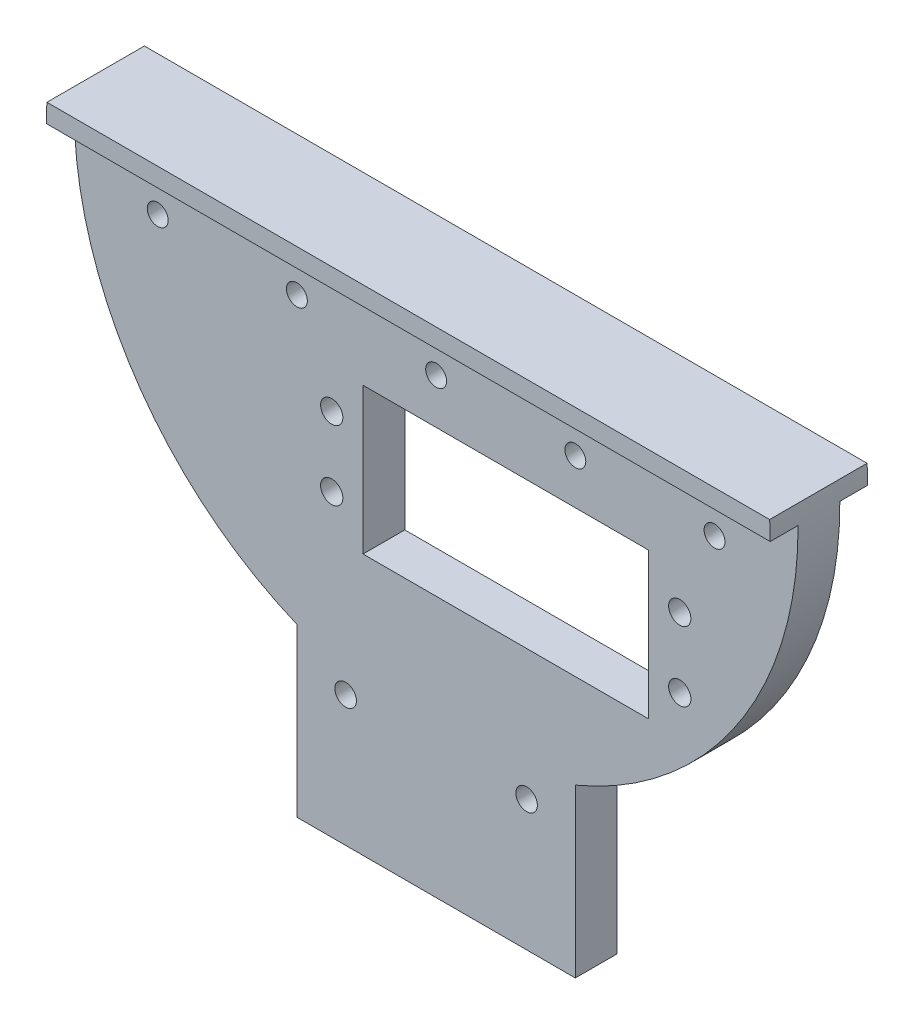
ISO-10303-21;
HEADER;
FILE_DESCRIPTION(('STEP AP214'),'2;1');
FILE_NAME('part.step','',(''),(''),'','','');
FILE_SCHEMA(('AUTOMOTIVE_DESIGN { 1 0 10303 214 1 1 1 1 }'));
ENDSEC;
DATA;
#1=APPLICATION_CONTEXT('core data for automotive mechanical design processes');
#2=APPLICATION_PROTOCOL_DEFINITION('international standard','automotive_design',2000,#1);
#3=PRODUCT_CONTEXT('',#1,'mechanical');
#4=PRODUCT('Part','Part','',(#3));
#5=PRODUCT_RELATED_PRODUCT_CATEGORY('part','',(#4));
#6=PRODUCT_DEFINITION_FORMATION('','',#4);
#7=PRODUCT_DEFINITION_CONTEXT('part definition',#1,'design');
#8=PRODUCT_DEFINITION('design','',#6,#7);
#9=PRODUCT_DEFINITION_SHAPE('','',#8);
#10=(LENGTH_UNIT() NAMED_UNIT(*) SI_UNIT(.MILLI.,.METRE.));
#11=(NAMED_UNIT(*) PLANE_ANGLE_UNIT() SI_UNIT($,.RADIAN.));
#12=(NAMED_UNIT(*) SI_UNIT($,.STERADIAN.) SOLID_ANGLE_UNIT());
#13=UNCERTAINTY_MEASURE_WITH_UNIT(LENGTH_MEASURE(1.E-05),#10,'distance_accuracy_value','');
#14=(GEOMETRIC_REPRESENTATION_CONTEXT(3) GLOBAL_UNCERTAINTY_ASSIGNED_CONTEXT((#13)) GLOBAL_UNIT_ASSIGNED_CONTEXT((#10,
#11,#12)) REPRESENTATION_CONTEXT('',''));
#15=CARTESIAN_POINT('',(0.,0.,0.));
#16=DIRECTION('',(0.,0.,1.));
#17=DIRECTION('',(1.,0.,0.));
#18=AXIS2_PLACEMENT_3D('',#15,#16,#17);
#19=CARTESIAN_POINT('',(3.54838286276805,43.7365457320988,14.));
#20=DIRECTION('',(0.,0.,-1.));
#21=DIRECTION('',(-1.,0.,0.));
#22=AXIS2_PLACEMENT_3D('',#19,#20,#21);
#23=CYLINDRICAL_SURFACE('',#22,52.);
#24=DIRECTION('',(0.,0.,-1.));
#25=VECTOR('',#24,1.);
#26=CARTESIAN_POINT('',(55.5475174709517,44.0365457320988,14.));
#27=LINE('',#26,#25);
#28=CARTESIAN_POINT('',(55.5475174709517,44.0365457320988,14.));
#29=VERTEX_POINT('',#28);
#30=CARTESIAN_POINT('',(55.5475174709517,44.0365457320988,10.));
#31=VERTEX_POINT('',#30);
#32=EDGE_CURVE('E196',#29,#31,#27,.T.);
#33=ORIENTED_EDGE('',*,*,#32,.T.);
#34=CARTESIAN_POINT('',(3.54838286276805,43.7365457320988,10.));
#35=DIRECTION('',(0.,0.,1.));
#36=DIRECTION('',(0.,-1.,0.));
#37=AXIS2_PLACEMENT_3D('',#34,#35,#36);
#38=CIRCLE('',#37,52.);
#39=CARTESIAN_POINT('',(23.548382862768,-4.26345426790124,10.));
#40=VERTEX_POINT('',#39);
#41=EDGE_CURVE('E256',#31,#40,#38,.F.);
#42=ORIENTED_EDGE('',*,*,#41,.T.);
#43=DIRECTION('',(0.,0.,-1.));
#44=VECTOR('',#43,1.);
#45=CARTESIAN_POINT('',(23.548382862768,-4.26345426790124,14.));
#46=LINE('',#45,#44);
#47=CARTESIAN_POINT('',(23.548382862768,-4.26345426790124,4.));
#48=VERTEX_POINT('',#47);
#49=EDGE_CURVE('E151',#40,#48,#46,.T.);
#50=ORIENTED_EDGE('',*,*,#49,.T.);
#51=CARTESIAN_POINT('',(3.54838286276805,43.7365457320988,4.));
#52=DIRECTION('',(0.,0.,-1.));
#53=DIRECTION('',(-1.,0.,0.));
#54=AXIS2_PLACEMENT_3D('',#51,#52,#53);
#55=CIRCLE('',#54,52.);
#56=CARTESIAN_POINT('',(55.5475174709517,44.0365457320988,4.));
#57=VERTEX_POINT('',#56);
#58=EDGE_CURVE('E200',#48,#57,#55,.F.);
#59=ORIENTED_EDGE('',*,*,#58,.T.);
#60=DIRECTION('',(0.,0.,-1.));
#61=VECTOR('',#60,1.);
#62=CARTESIAN_POINT('',(55.5475174709517,44.0365457320988,14.));
#63=LINE('',#62,#61);
#64=CARTESIAN_POINT('',(55.5475174709517,44.0365457320988,0.));
#65=VERTEX_POINT('',#64);
#66=EDGE_CURVE('E189',#57,#65,#63,.T.);
#67=ORIENTED_EDGE('',*,*,#66,.T.);
#68=CARTESIAN_POINT('',(3.54838286276805,43.7365457320988,0.));
#69=DIRECTION('',(0.,0.,1.));
#70=DIRECTION('',(1.,0.,0.));
#71=AXIS2_PLACEMENT_3D('',#68,#69,#70);
#72=CIRCLE('',#71,52.);
#73=CARTESIAN_POINT('',(55.4617722724377,46.7365457320988,0.));
#74=VERTEX_POINT('',#73);
#75=EDGE_CURVE('E311',#74,#65,#72,.F.);
#76=ORIENTED_EDGE('',*,*,#75,.F.);
#77=DIRECTION('',(0.,0.,-1.));
#78=VECTOR('',#77,1.);
#79=CARTESIAN_POINT('',(55.4617722724377,46.7365457320988,14.));
#80=LINE('',#79,#78);
#81=CARTESIAN_POINT('',(55.4617722724377,46.7365457320988,14.));
#82=VERTEX_POINT('',#81);
#83=EDGE_CURVE('E346',#82,#74,#80,.T.);
#84=ORIENTED_EDGE('',*,*,#83,.F.);
#85=CARTESIAN_POINT('',(3.54838286276805,43.7365457320988,14.));
#86=DIRECTION('',(0.,0.,1.));
#87=DIRECTION('',(1.,0.,0.));
#88=AXIS2_PLACEMENT_3D('',#85,#86,#87);
#89=CIRCLE('',#88,52.);
#90=EDGE_CURVE('E312',#82,#29,#89,.F.);
#91=ORIENTED_EDGE('',*,*,#90,.T.);
#92=EDGE_LOOP('',(#33,#42,#50,#59,#67,#76,#84,#91));
#93=FACE_BOUND('',#92,.T.);
#94=ADVANCED_FACE('F41',(#93),#23,.T.);
#95=CARTESIAN_POINT('',(3.54838286276805,43.7365457320988,14.));
#96=DIRECTION('',(0.,0.,-1.));
#97=DIRECTION('',(-1.,0.,0.));
#98=AXIS2_PLACEMENT_3D('',#95,#96,#97);
#99=CYLINDRICAL_SURFACE('',#98,52.);
#100=CARTESIAN_POINT('',(3.54838286276805,43.7365457320988,10.));
#101=DIRECTION('',(0.,0.,1.));
#102=DIRECTION('',(0.,-1.,0.));
#103=AXIS2_PLACEMENT_3D('',#100,#101,#102);
#104=CIRCLE('',#103,52.);
#105=CARTESIAN_POINT('',(-48.4507517454156,44.0365457320988,10.));
#106=VERTEX_POINT('',#105);
#107=CARTESIAN_POINT('',(-16.451617137232,-4.26345426790124,10.));
#108=VERTEX_POINT('',#107);
#109=EDGE_CURVE('E308',#106,#108,#104,.T.);
#110=ORIENTED_EDGE('',*,*,#109,.F.);
#111=DIRECTION('',(0.,0.,-1.));
#112=VECTOR('',#111,1.);
#113=CARTESIAN_POINT('',(-48.4507517454156,44.0365457320988,14.));
#114=LINE('',#113,#112);
#115=CARTESIAN_POINT('',(-48.4507517454156,44.0365457320988,14.));
#116=VERTEX_POINT('',#115);
#117=EDGE_CURVE('E193',#116,#106,#114,.T.);
#118=ORIENTED_EDGE('',*,*,#117,.F.);
#119=CARTESIAN_POINT('',(3.54838286276805,43.7365457320988,14.));
#120=DIRECTION('',(0.,0.,1.));
#121=DIRECTION('',(1.,0.,0.));
#122=AXIS2_PLACEMENT_3D('',#119,#120,#121);
#123=CIRCLE('',#122,52.);
#124=CARTESIAN_POINT('',(-48.3650065469016,46.7365457320988,14.));
#125=VERTEX_POINT('',#124);
#126=EDGE_CURVE('E321',#125,#116,#123,.T.);
#127=ORIENTED_EDGE('',*,*,#126,.F.);
#128=DIRECTION('',(0.,0.,-1.));
#129=VECTOR('',#128,1.);
#130=CARTESIAN_POINT('',(-48.3650065469016,46.7365457320988,14.));
#131=LINE('',#130,#129);
#132=CARTESIAN_POINT('',(-48.3650065469016,46.7365457320988,0.));
#133=VERTEX_POINT('',#132);
#134=EDGE_CURVE('E343',#125,#133,#131,.T.);
#135=ORIENTED_EDGE('',*,*,#134,.T.);
#136=CARTESIAN_POINT('',(3.54838286276805,43.7365457320988,0.));
#137=DIRECTION('',(0.,0.,1.));
#138=DIRECTION('',(1.,0.,0.));
#139=AXIS2_PLACEMENT_3D('',#136,#137,#138);
#140=CIRCLE('',#139,52.);
#141=CARTESIAN_POINT('',(-48.4507517454156,44.0365457320988,0.));
#142=VERTEX_POINT('',#141);
#143=EDGE_CURVE('E317',#133,#142,#140,.T.);
#144=ORIENTED_EDGE('',*,*,#143,.T.);
#145=DIRECTION('',(0.,0.,-1.));
#146=VECTOR('',#145,1.);
#147=CARTESIAN_POINT('',(-48.4507517454156,44.0365457320988,14.));
#148=LINE('',#147,#146);
#149=CARTESIAN_POINT('',(-48.4507517454156,44.0365457320988,4.));
#150=VERTEX_POINT('',#149);
#151=EDGE_CURVE('E183',#150,#142,#148,.T.);
#152=ORIENTED_EDGE('',*,*,#151,.F.);
#153=CARTESIAN_POINT('',(3.54838286276805,43.7365457320988,4.));
#154=DIRECTION('',(0.,0.,-1.));
#155=DIRECTION('',(-1.,0.,0.));
#156=AXIS2_PLACEMENT_3D('',#153,#154,#155);
#157=CIRCLE('',#156,52.);
#158=CARTESIAN_POINT('',(-16.451617137232,-4.26345426790124,4.));
#159=VERTEX_POINT('',#158);
#160=EDGE_CURVE('E253',#159,#150,#157,.T.);
#161=ORIENTED_EDGE('',*,*,#160,.F.);
#162=DIRECTION('',(0.,0.,-1.));
#163=VECTOR('',#162,1.);
#164=CARTESIAN_POINT('',(-16.451617137232,-4.26345426790124,14.));
#165=LINE('',#164,#163);
#166=EDGE_CURVE('E338',#108,#159,#165,.T.);
#167=ORIENTED_EDGE('',*,*,#166,.F.);
#168=EDGE_LOOP('',(#110,#118,#127,#135,#144,#152,#161,#167));
#169=FACE_BOUND('',#168,.T.);
#170=ADVANCED_FACE('F425',(#169),#99,.T.);
#171=CARTESIAN_POINT('',(-16.451617137232,0.,14.));
#172=DIRECTION('',(-1.,0.,0.));
#173=DIRECTION('',(0.,0.,1.));
#174=AXIS2_PLACEMENT_3D('',#171,#172,#173);
#175=PLANE('',#174);
#176=DIRECTION('',(0.,-1.,0.));
#177=VECTOR('',#176,1.);
#178=CARTESIAN_POINT('',(-16.451617137232,0.,4.));
#179=LINE('',#178,#177);
#180=CARTESIAN_POINT('',(-16.4516171372319,-28.2634542679012,4.));
#181=VERTEX_POINT('',#180);
#182=EDGE_CURVE('E250',#159,#181,#179,.T.);
#183=ORIENTED_EDGE('',*,*,#182,.T.);
#184=DIRECTION('',(0.,0.,-1.));
#185=VECTOR('',#184,1.);
#186=CARTESIAN_POINT('',(-16.4516171372319,-28.2634542679012,9.99999999999999));
#187=LINE('',#186,#185);
#188=CARTESIAN_POINT('',(-16.4516171372319,-28.2634542679012,9.99999999999999));
#189=VERTEX_POINT('',#188);
#190=EDGE_CURVE('E162',#189,#181,#187,.T.);
#191=ORIENTED_EDGE('',*,*,#190,.F.);
#192=DIRECTION('',(0.,1.,0.));
#193=VECTOR('',#192,1.);
#194=CARTESIAN_POINT('',(-16.451617137232,0.,10.));
#195=LINE('',#194,#193);
#196=EDGE_CURVE('E166',#189,#108,#195,.T.);
#197=ORIENTED_EDGE('',*,*,#196,.T.);
#198=ORIENTED_EDGE('',*,*,#166,.T.);
#199=EDGE_LOOP('',(#183,#191,#197,#198));
#200=FACE_BOUND('',#199,.T.);
#201=ADVANCED_FACE('F449',(#200),#175,.T.);
#202=CARTESIAN_POINT('',(23.548382862768,0.,14.));
#203=DIRECTION('',(-1.,0.,0.));
#204=DIRECTION('',(0.,0.,1.));
#205=AXIS2_PLACEMENT_3D('',#202,#203,#204);
#206=PLANE('',#205);
#207=DIRECTION('',(0.,1.,0.));
#208=VECTOR('',#207,1.);
#209=CARTESIAN_POINT('',(23.548382862768,0.,10.));
#210=LINE('',#209,#208);
#211=CARTESIAN_POINT('',(23.548382862768,-28.2634542679012,9.99999999999999));
#212=VERTEX_POINT('',#211);
#213=EDGE_CURVE('E11',#212,#40,#210,.T.);
#214=ORIENTED_EDGE('',*,*,#213,.F.);
#215=DIRECTION('',(0.,0.,-1.));
#216=VECTOR('',#215,1.);
#217=CARTESIAN_POINT('',(23.548382862768,-28.2634542679012,9.99999999999999));
#218=LINE('',#217,#216);
#219=CARTESIAN_POINT('',(23.548382862768,-28.2634542679012,4.));
#220=VERTEX_POINT('',#219);
#221=EDGE_CURVE('E148',#212,#220,#218,.T.);
#222=ORIENTED_EDGE('',*,*,#221,.T.);
#223=DIRECTION('',(0.,-1.,0.));
#224=VECTOR('',#223,1.);
#225=CARTESIAN_POINT('',(23.548382862768,0.,4.));
#226=LINE('',#225,#224);
#227=EDGE_CURVE('E51',#48,#220,#226,.T.);
#228=ORIENTED_EDGE('',*,*,#227,.F.);
#229=ORIENTED_EDGE('',*,*,#49,.F.);
#230=EDGE_LOOP('',(#214,#222,#228,#229));
#231=FACE_BOUND('',#230,.T.);
#232=ADVANCED_FACE('F146',(#231),#206,.F.);
#233=CARTESIAN_POINT('',(0.,0.,14.));
#234=DIRECTION('',(0.,0.,1.));
#235=DIRECTION('',(1.,0.,0.));
#236=AXIS2_PLACEMENT_3D('',#233,#234,#235);
#237=PLANE('',#236);
#238=ORIENTED_EDGE('',*,*,#126,.T.);
#239=DIRECTION('',(1.,0.,0.));
#240=VECTOR('',#239,1.);
#241=CARTESIAN_POINT('',(0.,44.0365457320988,14.));
#242=LINE('',#241,#240);
#243=EDGE_CURVE('E366',#116,#29,#242,.T.);
#244=ORIENTED_EDGE('',*,*,#243,.T.);
#245=ORIENTED_EDGE('',*,*,#90,.F.);
#246=DIRECTION('',(1.,0.,0.));
#247=VECTOR('',#246,1.);
#248=CARTESIAN_POINT('',(0.,46.7365457320988,14.));
#249=LINE('',#248,#247);
#250=EDGE_CURVE('E316',#125,#82,#249,.T.);
#251=ORIENTED_EDGE('',*,*,#250,.F.);
#252=EDGE_LOOP('',(#238,#244,#245,#251));
#253=FACE_BOUND('',#252,.T.);
#254=ADVANCED_FACE('F441',(#253),#237,.T.);
#255=CARTESIAN_POINT('',(0.,0.,0.));
#256=DIRECTION('',(0.,0.,1.));
#257=DIRECTION('',(1.,0.,0.));
#258=AXIS2_PLACEMENT_3D('',#255,#256,#257);
#259=PLANE('',#258);
#260=DIRECTION('',(1.,0.,0.));
#261=VECTOR('',#260,1.);
#262=CARTESIAN_POINT('',(0.,44.0365457320988,0.));
#263=LINE('',#262,#261);
#264=EDGE_CURVE('E349',#142,#65,#263,.T.);
#265=ORIENTED_EDGE('',*,*,#264,.F.);
#266=ORIENTED_EDGE('',*,*,#143,.F.);
#267=DIRECTION('',(1.,0.,0.));
#268=VECTOR('',#267,1.);
#269=CARTESIAN_POINT('',(0.,46.7365457320988,0.));
#270=LINE('',#269,#268);
#271=EDGE_CURVE('E329',#133,#74,#270,.T.);
#272=ORIENTED_EDGE('',*,*,#271,.T.);
#273=ORIENTED_EDGE('',*,*,#75,.T.);
#274=EDGE_LOOP('',(#265,#266,#272,#273));
#275=FACE_BOUND('',#274,.T.);
#276=ADVANCED_FACE('F430',(#275),#259,.F.);
#277=CARTESIAN_POINT('',(0.,46.7365457320988,14.));
#278=DIRECTION('',(0.,1.,0.));
#279=DIRECTION('',(0.,0.,1.));
#280=AXIS2_PLACEMENT_3D('',#277,#278,#279);
#281=PLANE('',#280);
#282=ORIENTED_EDGE('',*,*,#271,.F.);
#283=ORIENTED_EDGE('',*,*,#134,.F.);
#284=ORIENTED_EDGE('',*,*,#250,.T.);
#285=ORIENTED_EDGE('',*,*,#83,.T.);
#286=EDGE_LOOP('',(#282,#283,#284,#285));
#287=FACE_BOUND('',#286,.T.);
#288=ADVANCED_FACE('F395',(#287),#281,.T.);
#289=CARTESIAN_POINT('',(-48.451617137232,0.,4.));
#290=DIRECTION('',(0.,0.,-1.));
#291=DIRECTION('',(-1.,0.,0.));
#292=AXIS2_PLACEMENT_3D('',#289,#290,#291);
#293=PLANE('',#292);
#294=CARTESIAN_POINT('',(16.548382862768,-9.51345426790117,4.));
#295=DIRECTION('',(0.,0.,-1.));
#296=DIRECTION('',(-1.,0.,0.));
#297=AXIS2_PLACEMENT_3D('',#294,#295,#296);
#298=CIRCLE('',#297,1.55);
#299=CARTESIAN_POINT('',(14.998382862768,-9.51345426790117,4.));
#300=VERTEX_POINT('',#299);
#301=EDGE_CURVE('E171',#300,#300,#298,.T.);
#302=ORIENTED_EDGE('',*,*,#301,.F.);
#303=EDGE_LOOP('',(#302));
#304=FACE_BOUND('',#303,.T.);
#305=CARTESIAN_POINT('',(-9.45161713723196,-9.51345426790116,4.));
#306=DIRECTION('',(0.,0.,-1.));
#307=DIRECTION('',(-1.,0.,0.));
#308=AXIS2_PLACEMENT_3D('',#305,#306,#307);
#309=CIRCLE('',#308,1.55);
#310=CARTESIAN_POINT('',(-11.001617137232,-9.51345426790116,4.));
#311=VERTEX_POINT('',#310);
#312=EDGE_CURVE('E374',#311,#311,#309,.T.);
#313=ORIENTED_EDGE('',*,*,#312,.F.);
#314=EDGE_LOOP('',(#313));
#315=FACE_BOUND('',#314,.T.);
#316=CARTESIAN_POINT('',(43.548382862768,36.7365457320988,4.));
#317=DIRECTION('',(0.,0.,-1.));
#318=DIRECTION('',(-1.,0.,0.));
#319=AXIS2_PLACEMENT_3D('',#316,#317,#318);
#320=CIRCLE('',#319,1.5);
#321=CARTESIAN_POINT('',(42.048382862768,36.7365457320988,4.));
#322=VERTEX_POINT('',#321);
#323=EDGE_CURVE('E246',#322,#322,#320,.T.);
#324=ORIENTED_EDGE('',*,*,#323,.F.);
#325=EDGE_LOOP('',(#324));
#326=FACE_BOUND('',#325,.T.);
#327=CARTESIAN_POINT('',(23.548382862768,36.7365457320988,4.));
#328=DIRECTION('',(0.,0.,-1.));
#329=DIRECTION('',(-1.,0.,0.));
#330=AXIS2_PLACEMENT_3D('',#327,#328,#329);
#331=CIRCLE('',#330,1.5);
#332=CARTESIAN_POINT('',(22.048382862768,36.7365457320988,4.));
#333=VERTEX_POINT('',#332);
#334=EDGE_CURVE('E242',#333,#333,#331,.T.);
#335=ORIENTED_EDGE('',*,*,#334,.F.);
#336=EDGE_LOOP('',(#335));
#337=FACE_BOUND('',#336,.T.);
#338=CARTESIAN_POINT('',(3.54838286276804,36.7365457320988,4.));
#339=DIRECTION('',(0.,0.,-1.));
#340=DIRECTION('',(-1.,0.,0.));
#341=AXIS2_PLACEMENT_3D('',#338,#339,#340);
#342=CIRCLE('',#341,1.5);
#343=CARTESIAN_POINT('',(2.04838286276804,36.7365457320988,4.));
#344=VERTEX_POINT('',#343);
#345=EDGE_CURVE('E238',#344,#344,#342,.T.);
#346=ORIENTED_EDGE('',*,*,#345,.F.);
#347=EDGE_LOOP('',(#346));
#348=FACE_BOUND('',#347,.T.);
#349=CARTESIAN_POINT('',(-16.451617137232,36.7365457320988,4.));
#350=DIRECTION('',(0.,0.,-1.));
#351=DIRECTION('',(-1.,0.,0.));
#352=AXIS2_PLACEMENT_3D('',#349,#350,#351);
#353=CIRCLE('',#352,1.5);
#354=CARTESIAN_POINT('',(-17.951617137232,36.7365457320988,4.));
#355=VERTEX_POINT('',#354);
#356=EDGE_CURVE('E234',#355,#355,#353,.T.);
#357=ORIENTED_EDGE('',*,*,#356,.F.);
#358=EDGE_LOOP('',(#357));
#359=FACE_BOUND('',#358,.T.);
#360=CARTESIAN_POINT('',(-36.451617137232,36.7365457320988,4.));
#361=DIRECTION('',(0.,0.,-1.));
#362=DIRECTION('',(-1.,0.,0.));
#363=AXIS2_PLACEMENT_3D('',#360,#361,#362);
#364=CIRCLE('',#363,1.5);
#365=CARTESIAN_POINT('',(-37.951617137232,36.7365457320988,4.));
#366=VERTEX_POINT('',#365);
#367=EDGE_CURVE('E230',#366,#366,#364,.T.);
#368=ORIENTED_EDGE('',*,*,#367,.F.);
#369=EDGE_LOOP('',(#368));
#370=FACE_BOUND('',#369,.T.);
#371=CARTESIAN_POINT('',(38.5483828627674,14.7365457320991,4.));
#372=DIRECTION('',(0.,0.,-1.));
#373=DIRECTION('',(-1.,0.,0.));
#374=AXIS2_PLACEMENT_3D('',#371,#372,#373);
#375=CIRCLE('',#374,1.6);
#376=CARTESIAN_POINT('',(36.9483828627675,14.7365457320991,4.));
#377=VERTEX_POINT('',#376);
#378=EDGE_CURVE('E226',#377,#377,#375,.T.);
#379=ORIENTED_EDGE('',*,*,#378,.F.);
#380=EDGE_LOOP('',(#379));
#381=FACE_BOUND('',#380,.T.);
#382=CARTESIAN_POINT('',(38.5483828627674,24.736545732099,4.));
#383=DIRECTION('',(0.,0.,-1.));
#384=DIRECTION('',(-1.,0.,0.));
#385=AXIS2_PLACEMENT_3D('',#382,#383,#384);
#386=CIRCLE('',#385,1.6);
#387=CARTESIAN_POINT('',(36.9483828627675,24.736545732099,4.));
#388=VERTEX_POINT('',#387);
#389=EDGE_CURVE('E222',#388,#388,#386,.T.);
#390=ORIENTED_EDGE('',*,*,#389,.F.);
#391=EDGE_LOOP('',(#390));
#392=FACE_BOUND('',#391,.T.);
#393=CARTESIAN_POINT('',(-11.4516171372323,14.7365457320989,4.));
#394=DIRECTION('',(0.,0.,-1.));
#395=DIRECTION('',(-1.,0.,0.));
#396=AXIS2_PLACEMENT_3D('',#393,#394,#395);
#397=CIRCLE('',#396,1.6);
#398=CARTESIAN_POINT('',(-13.0516171372323,14.7365457320989,4.));
#399=VERTEX_POINT('',#398);
#400=EDGE_CURVE('E218',#399,#399,#397,.T.);
#401=ORIENTED_EDGE('',*,*,#400,.F.);
#402=EDGE_LOOP('',(#401));
#403=FACE_BOUND('',#402,.T.);
#404=CARTESIAN_POINT('',(-11.4516171372323,24.7365457320989,4.));
#405=DIRECTION('',(0.,0.,-1.));
#406=DIRECTION('',(-1.,0.,0.));
#407=AXIS2_PLACEMENT_3D('',#404,#405,#406);
#408=CIRCLE('',#407,1.6);
#409=CARTESIAN_POINT('',(-13.0516171372323,24.7365457320989,4.));
#410=VERTEX_POINT('',#409);
#411=EDGE_CURVE('E214',#410,#410,#408,.T.);
#412=ORIENTED_EDGE('',*,*,#411,.F.);
#413=EDGE_LOOP('',(#412));
#414=FACE_BOUND('',#413,.T.);
#415=DIRECTION('',(1.,0.,0.));
#416=VECTOR('',#415,1.);
#417=CARTESIAN_POINT('',(0.,9.23654573209887,4.));
#418=LINE('',#417,#416);
#419=CARTESIAN_POINT('',(-6.95161713724666,9.23654573209887,4.));
#420=VERTEX_POINT('',#419);
#421=CARTESIAN_POINT('',(34.0483828627822,9.23654573209887,4.));
#422=VERTEX_POINT('',#421);
#423=EDGE_CURVE('E67',#420,#422,#418,.T.);
#424=ORIENTED_EDGE('',*,*,#423,.T.);
#425=DIRECTION('',(0.,1.,0.));
#426=VECTOR('',#425,1.);
#427=CARTESIAN_POINT('',(34.0483828627822,0.,4.));
#428=LINE('',#427,#426);
#429=CARTESIAN_POINT('',(34.0483828627822,30.2365457321279,4.));
#430=VERTEX_POINT('',#429);
#431=EDGE_CURVE('E203',#422,#430,#428,.T.);
#432=ORIENTED_EDGE('',*,*,#431,.T.);
#433=DIRECTION('',(-1.,0.,0.));
#434=VECTOR('',#433,1.);
#435=CARTESIAN_POINT('',(0.,30.2365457321279,4.));
#436=LINE('',#435,#434);
#437=CARTESIAN_POINT('',(-6.95161713724666,30.2365457321279,4.));
#438=VERTEX_POINT('',#437);
#439=EDGE_CURVE('E206',#430,#438,#436,.T.);
#440=ORIENTED_EDGE('',*,*,#439,.T.);
#441=DIRECTION('',(0.,-1.,0.));
#442=VECTOR('',#441,1.);
#443=CARTESIAN_POINT('',(-6.95161713724666,0.,4.));
#444=LINE('',#443,#442);
#445=EDGE_CURVE('E209',#438,#420,#444,.T.);
#446=ORIENTED_EDGE('',*,*,#445,.T.);
#447=EDGE_LOOP('',(#424,#432,#440,#446));
#448=FACE_BOUND('',#447,.T.);
#449=ORIENTED_EDGE('',*,*,#160,.T.);
#450=DIRECTION('',(1.,0.,0.));
#451=VECTOR('',#450,1.);
#452=CARTESIAN_POINT('',(-48.451617137232,44.0365457320988,4.));
#453=LINE('',#452,#451);
#454=EDGE_CURVE('E177',#150,#57,#453,.T.);
#455=ORIENTED_EDGE('',*,*,#454,.T.);
#456=ORIENTED_EDGE('',*,*,#58,.F.);
#457=ORIENTED_EDGE('',*,*,#227,.T.);
#458=DIRECTION('',(-1.,0.,0.));
#459=VECTOR('',#458,1.);
#460=CARTESIAN_POINT('',(23.548382862768,-28.2634542679012,4.));
#461=LINE('',#460,#459);
#462=EDGE_CURVE('E160',#220,#181,#461,.T.);
#463=ORIENTED_EDGE('',*,*,#462,.T.);
#464=ORIENTED_EDGE('',*,*,#182,.F.);
#465=EDGE_LOOP('',(#449,#455,#456,#457,#463,#464));
#466=FACE_BOUND('',#465,.T.);
#467=ADVANCED_FACE('F391',(#304,#315,#326,#337,#348,#359,#370,#381,#392,#403,#414,#448,#466),
#293,.T.);
#468=CARTESIAN_POINT('',(-48.451617137232,44.0365457320988,0.));
#469=DIRECTION('',(0.,-1.,0.));
#470=DIRECTION('',(0.,0.,-1.));
#471=AXIS2_PLACEMENT_3D('',#468,#469,#470);
#472=PLANE('',#471);
#473=ORIENTED_EDGE('',*,*,#454,.F.);
#474=ORIENTED_EDGE('',*,*,#151,.T.);
#475=ORIENTED_EDGE('',*,*,#264,.T.);
#476=ORIENTED_EDGE('',*,*,#66,.F.);
#477=EDGE_LOOP('',(#473,#474,#475,#476));
#478=FACE_BOUND('',#477,.T.);
#479=ADVANCED_FACE('F394',(#478),#472,.T.);
#480=CARTESIAN_POINT('',(-48.451617137232,0.,10.));
#481=DIRECTION('',(0.,0.,1.));
#482=DIRECTION('',(0.,-1.,0.));
#483=AXIS2_PLACEMENT_3D('',#480,#481,#482);
#484=PLANE('',#483);
#485=CARTESIAN_POINT('',(16.548382862768,-9.51345426790117,10.));
#486=DIRECTION('',(0.,0.,1.));
#487=DIRECTION('',(0.,-1.,0.));
#488=AXIS2_PLACEMENT_3D('',#485,#486,#487);
#489=CIRCLE('',#488,1.55);
#490=CARTESIAN_POINT('',(16.548382862768,-11.0634542679012,10.));
#491=VERTEX_POINT('',#490);
#492=EDGE_CURVE('E45',#491,#491,#489,.T.);
#493=ORIENTED_EDGE('',*,*,#492,.F.);
#494=EDGE_LOOP('',(#493));
#495=FACE_BOUND('',#494,.T.);
#496=CARTESIAN_POINT('',(-9.45161713723196,-9.51345426790116,10.));
#497=DIRECTION('',(0.,0.,1.));
#498=DIRECTION('',(0.,-1.,0.));
#499=AXIS2_PLACEMENT_3D('',#496,#497,#498);
#500=CIRCLE('',#499,1.55);
#501=CARTESIAN_POINT('',(-9.45161713723196,-11.0634542679012,10.));
#502=VERTEX_POINT('',#501);
#503=EDGE_CURVE('E371',#502,#502,#500,.T.);
#504=ORIENTED_EDGE('',*,*,#503,.F.);
#505=EDGE_LOOP('',(#504));
#506=FACE_BOUND('',#505,.T.);
#507=CARTESIAN_POINT('',(43.548382862768,36.7365457320988,10.));
#508=DIRECTION('',(0.,0.,1.));
#509=DIRECTION('',(0.,-1.,0.));
#510=AXIS2_PLACEMENT_3D('',#507,#508,#509);
#511=CIRCLE('',#510,1.5);
#512=CARTESIAN_POINT('',(43.548382862768,35.2365457320988,10.));
#513=VERTEX_POINT('',#512);
#514=EDGE_CURVE('E302',#513,#513,#511,.T.);
#515=ORIENTED_EDGE('',*,*,#514,.F.);
#516=EDGE_LOOP('',(#515));
#517=FACE_BOUND('',#516,.T.);
#518=CARTESIAN_POINT('',(23.548382862768,36.7365457320988,10.));
#519=DIRECTION('',(0.,0.,1.));
#520=DIRECTION('',(0.,-1.,0.));
#521=AXIS2_PLACEMENT_3D('',#518,#519,#520);
#522=CIRCLE('',#521,1.5);
#523=CARTESIAN_POINT('',(23.548382862768,35.2365457320988,10.));
#524=VERTEX_POINT('',#523);
#525=EDGE_CURVE('E298',#524,#524,#522,.T.);
#526=ORIENTED_EDGE('',*,*,#525,.F.);
#527=EDGE_LOOP('',(#526));
#528=FACE_BOUND('',#527,.T.);
#529=CARTESIAN_POINT('',(3.54838286276804,36.7365457320988,10.));
#530=DIRECTION('',(0.,0.,1.));
#531=DIRECTION('',(0.,-1.,0.));
#532=AXIS2_PLACEMENT_3D('',#529,#530,#531);
#533=CIRCLE('',#532,1.5);
#534=CARTESIAN_POINT('',(3.54838286276804,35.2365457320988,10.));
#535=VERTEX_POINT('',#534);
#536=EDGE_CURVE('E294',#535,#535,#533,.T.);
#537=ORIENTED_EDGE('',*,*,#536,.F.);
#538=EDGE_LOOP('',(#537));
#539=FACE_BOUND('',#538,.T.);
#540=CARTESIAN_POINT('',(-16.451617137232,36.7365457320988,10.));
#541=DIRECTION('',(0.,0.,1.));
#542=DIRECTION('',(0.,-1.,0.));
#543=AXIS2_PLACEMENT_3D('',#540,#541,#542);
#544=CIRCLE('',#543,1.5);
#545=CARTESIAN_POINT('',(-16.451617137232,35.2365457320988,10.));
#546=VERTEX_POINT('',#545);
#547=EDGE_CURVE('E290',#546,#546,#544,.T.);
#548=ORIENTED_EDGE('',*,*,#547,.F.);
#549=EDGE_LOOP('',(#548));
#550=FACE_BOUND('',#549,.T.);
#551=CARTESIAN_POINT('',(-36.451617137232,36.7365457320988,10.));
#552=DIRECTION('',(0.,0.,1.));
#553=DIRECTION('',(0.,-1.,0.));
#554=AXIS2_PLACEMENT_3D('',#551,#552,#553);
#555=CIRCLE('',#554,1.5);
#556=CARTESIAN_POINT('',(-36.451617137232,35.2365457320988,10.));
#557=VERTEX_POINT('',#556);
#558=EDGE_CURVE('E286',#557,#557,#555,.T.);
#559=ORIENTED_EDGE('',*,*,#558,.F.);
#560=EDGE_LOOP('',(#559));
#561=FACE_BOUND('',#560,.T.);
#562=CARTESIAN_POINT('',(38.5483828627674,14.7365457320991,10.));
#563=DIRECTION('',(0.,0.,1.));
#564=DIRECTION('',(0.,-1.,0.));
#565=AXIS2_PLACEMENT_3D('',#562,#563,#564);
#566=CIRCLE('',#565,1.6);
#567=CARTESIAN_POINT('',(38.5483828627674,13.1365457320991,10.));
#568=VERTEX_POINT('',#567);
#569=EDGE_CURVE('E282',#568,#568,#566,.T.);
#570=ORIENTED_EDGE('',*,*,#569,.F.);
#571=EDGE_LOOP('',(#570));
#572=FACE_BOUND('',#571,.T.);
#573=CARTESIAN_POINT('',(38.5483828627674,24.736545732099,10.));
#574=DIRECTION('',(0.,0.,1.));
#575=DIRECTION('',(0.,-1.,0.));
#576=AXIS2_PLACEMENT_3D('',#573,#574,#575);
#577=CIRCLE('',#576,1.6);
#578=CARTESIAN_POINT('',(38.5483828627674,23.136545732099,10.));
#579=VERTEX_POINT('',#578);
#580=EDGE_CURVE('E278',#579,#579,#577,.T.);
#581=ORIENTED_EDGE('',*,*,#580,.F.);
#582=EDGE_LOOP('',(#581));
#583=FACE_BOUND('',#582,.T.);
#584=CARTESIAN_POINT('',(-11.4516171372323,14.7365457320989,10.));
#585=DIRECTION('',(0.,0.,1.));
#586=DIRECTION('',(0.,-1.,0.));
#587=AXIS2_PLACEMENT_3D('',#584,#585,#586);
#588=CIRCLE('',#587,1.6);
#589=CARTESIAN_POINT('',(-11.4516171372323,13.1365457320989,10.));
#590=VERTEX_POINT('',#589);
#591=EDGE_CURVE('E274',#590,#590,#588,.T.);
#592=ORIENTED_EDGE('',*,*,#591,.F.);
#593=EDGE_LOOP('',(#592));
#594=FACE_BOUND('',#593,.T.);
#595=CARTESIAN_POINT('',(-11.4516171372323,24.7365457320989,10.));
#596=DIRECTION('',(0.,0.,1.));
#597=DIRECTION('',(0.,-1.,0.));
#598=AXIS2_PLACEMENT_3D('',#595,#596,#597);
#599=CIRCLE('',#598,1.6);
#600=CARTESIAN_POINT('',(-11.4516171372323,23.1365457320989,10.));
#601=VERTEX_POINT('',#600);
#602=EDGE_CURVE('E270',#601,#601,#599,.T.);
#603=ORIENTED_EDGE('',*,*,#602,.F.);
#604=EDGE_LOOP('',(#603));
#605=FACE_BOUND('',#604,.T.);
#606=DIRECTION('',(-1.,0.,0.));
#607=VECTOR('',#606,1.);
#608=CARTESIAN_POINT('',(0.,9.23654573209887,10.));
#609=LINE('',#608,#607);
#610=CARTESIAN_POINT('',(34.0483828627822,9.23654573209887,10.));
#611=VERTEX_POINT('',#610);
#612=CARTESIAN_POINT('',(-6.95161713724666,9.23654573209887,10.));
#613=VERTEX_POINT('',#612);
#614=EDGE_CURVE('E267',#611,#613,#609,.T.);
#615=ORIENTED_EDGE('',*,*,#614,.T.);
#616=DIRECTION('',(0.,1.,0.));
#617=VECTOR('',#616,1.);
#618=CARTESIAN_POINT('',(-6.95161713724666,0.,10.));
#619=LINE('',#618,#617);
#620=CARTESIAN_POINT('',(-6.95161713724666,30.2365457321279,10.));
#621=VERTEX_POINT('',#620);
#622=EDGE_CURVE('E264',#613,#621,#619,.T.);
#623=ORIENTED_EDGE('',*,*,#622,.T.);
#624=DIRECTION('',(1.,0.,0.));
#625=VECTOR('',#624,1.);
#626=CARTESIAN_POINT('',(0.,30.2365457321279,10.));
#627=LINE('',#626,#625);
#628=CARTESIAN_POINT('',(34.0483828627822,30.2365457321279,10.));
#629=VERTEX_POINT('',#628);
#630=EDGE_CURVE('E59',#621,#629,#627,.T.);
#631=ORIENTED_EDGE('',*,*,#630,.T.);
#632=DIRECTION('',(0.,-1.,0.));
#633=VECTOR('',#632,1.);
#634=CARTESIAN_POINT('',(34.0483828627822,0.,10.));
#635=LINE('',#634,#633);
#636=EDGE_CURVE('E259',#629,#611,#635,.T.);
#637=ORIENTED_EDGE('',*,*,#636,.T.);
#638=EDGE_LOOP('',(#615,#623,#631,#637));
#639=FACE_BOUND('',#638,.T.);
#640=ORIENTED_EDGE('',*,*,#109,.T.);
#641=ORIENTED_EDGE('',*,*,#196,.F.);
#642=DIRECTION('',(-1.,0.,0.));
#643=VECTOR('',#642,1.);
#644=CARTESIAN_POINT('',(23.548382862768,-28.2634542679012,9.99999999999999));
#645=LINE('',#644,#643);
#646=EDGE_CURVE('E158',#212,#189,#645,.T.);
#647=ORIENTED_EDGE('',*,*,#646,.F.);
#648=ORIENTED_EDGE('',*,*,#213,.T.);
#649=ORIENTED_EDGE('',*,*,#41,.F.);
#650=DIRECTION('',(1.,0.,0.));
#651=VECTOR('',#650,1.);
#652=CARTESIAN_POINT('',(-48.451617137232,44.0365457320988,10.));
#653=LINE('',#652,#651);
#654=EDGE_CURVE('E179',#106,#31,#653,.T.);
#655=ORIENTED_EDGE('',*,*,#654,.F.);
#656=EDGE_LOOP('',(#640,#641,#647,#648,#649,#655));
#657=FACE_BOUND('',#656,.T.);
#658=ADVANCED_FACE('F164',(#495,#506,#517,#528,#539,#550,#561,#572,#583,#594,#605,#639,#657),
#484,.T.);
#659=CARTESIAN_POINT('',(-48.451617137232,44.0365457320988,0.));
#660=DIRECTION('',(0.,-1.,0.));
#661=DIRECTION('',(0.,0.,-1.));
#662=AXIS2_PLACEMENT_3D('',#659,#660,#661);
#663=PLANE('',#662);
#664=ORIENTED_EDGE('',*,*,#243,.F.);
#665=ORIENTED_EDGE('',*,*,#117,.T.);
#666=ORIENTED_EDGE('',*,*,#654,.T.);
#667=ORIENTED_EDGE('',*,*,#32,.F.);
#668=EDGE_LOOP('',(#664,#665,#666,#667));
#669=FACE_BOUND('',#668,.T.);
#670=ADVANCED_FACE('F438',(#669),#663,.T.);
#671=CARTESIAN_POINT('',(34.0483828627822,0.,14.));
#672=DIRECTION('',(1.,0.,0.));
#673=DIRECTION('',(0.,1.,0.));
#674=AXIS2_PLACEMENT_3D('',#671,#672,#673);
#675=PLANE('',#674);
#676=ORIENTED_EDGE('',*,*,#636,.F.);
#677=DIRECTION('',(0.,0.,-1.));
#678=VECTOR('',#677,1.);
#679=CARTESIAN_POINT('',(34.0483828627822,30.2365457321279,14.));
#680=LINE('',#679,#678);
#681=EDGE_CURVE('E353',#629,#430,#680,.T.);
#682=ORIENTED_EDGE('',*,*,#681,.T.);
#683=ORIENTED_EDGE('',*,*,#431,.F.);
#684=DIRECTION('',(0.,0.,-1.));
#685=VECTOR('',#684,1.);
#686=CARTESIAN_POINT('',(34.0483828627822,9.23654573209887,14.));
#687=LINE('',#686,#685);
#688=EDGE_CURVE('E325',#611,#422,#687,.T.);
#689=ORIENTED_EDGE('',*,*,#688,.F.);
#690=EDGE_LOOP('',(#676,#682,#683,#689));
#691=FACE_BOUND('',#690,.T.);
#692=ADVANCED_FACE('F496',(#691),#675,.F.);
#693=CARTESIAN_POINT('',(0.,30.2365457321279,14.));
#694=DIRECTION('',(0.,1.,0.));
#695=DIRECTION('',(0.,0.,1.));
#696=AXIS2_PLACEMENT_3D('',#693,#694,#695);
#697=PLANE('',#696);
#698=ORIENTED_EDGE('',*,*,#630,.F.);
#699=DIRECTION('',(0.,0.,-1.));
#700=VECTOR('',#699,1.);
#701=CARTESIAN_POINT('',(-6.95161713724666,30.2365457321279,14.));
#702=LINE('',#701,#700);
#703=EDGE_CURVE('E357',#621,#438,#702,.T.);
#704=ORIENTED_EDGE('',*,*,#703,.T.);
#705=ORIENTED_EDGE('',*,*,#439,.F.);
#706=ORIENTED_EDGE('',*,*,#681,.F.);
#707=EDGE_LOOP('',(#698,#704,#705,#706));
#708=FACE_BOUND('',#707,.T.);
#709=ADVANCED_FACE('F499',(#708),#697,.F.);
#710=CARTESIAN_POINT('',(-6.95161713724666,0.,14.));
#711=DIRECTION('',(-1.,0.,0.));
#712=DIRECTION('',(0.,0.,1.));
#713=AXIS2_PLACEMENT_3D('',#710,#711,#712);
#714=PLANE('',#713);
#715=ORIENTED_EDGE('',*,*,#622,.F.);
#716=DIRECTION('',(0.,0.,-1.));
#717=VECTOR('',#716,1.);
#718=CARTESIAN_POINT('',(-6.95161713724666,9.23654573209887,14.));
#719=LINE('',#718,#717);
#720=EDGE_CURVE('E339',#613,#420,#719,.T.);
#721=ORIENTED_EDGE('',*,*,#720,.T.);
#722=ORIENTED_EDGE('',*,*,#445,.F.);
#723=ORIENTED_EDGE('',*,*,#703,.F.);
#724=EDGE_LOOP('',(#715,#721,#722,#723));
#725=FACE_BOUND('',#724,.T.);
#726=ADVANCED_FACE('F502',(#725),#714,.F.);
#727=CARTESIAN_POINT('',(0.,9.23654573209887,14.));
#728=DIRECTION('',(0.,-1.,0.));
#729=DIRECTION('',(0.,0.,-1.));
#730=AXIS2_PLACEMENT_3D('',#727,#728,#729);
#731=PLANE('',#730);
#732=ORIENTED_EDGE('',*,*,#614,.F.);
#733=ORIENTED_EDGE('',*,*,#688,.T.);
#734=ORIENTED_EDGE('',*,*,#423,.F.);
#735=ORIENTED_EDGE('',*,*,#720,.F.);
#736=EDGE_LOOP('',(#732,#733,#734,#735));
#737=FACE_BOUND('',#736,.T.);
#738=ADVANCED_FACE('F43',(#737),#731,.F.);
#739=CARTESIAN_POINT('',(-11.4516171372323,24.7365457320989,14.));
#740=DIRECTION('',(0.,0.,-1.));
#741=DIRECTION('',(-1.,0.,0.));
#742=AXIS2_PLACEMENT_3D('',#739,#740,#741);
#743=CYLINDRICAL_SURFACE('',#742,1.6);
#744=ORIENTED_EDGE('',*,*,#411,.T.);
#745=EDGE_LOOP('',(#744));
#746=FACE_BOUND('',#745,.T.);
#747=ORIENTED_EDGE('',*,*,#602,.T.);
#748=EDGE_LOOP('',(#747));
#749=FACE_BOUND('',#748,.T.);
#750=ADVANCED_FACE('F491',(#746,#749),#743,.F.);
#751=CARTESIAN_POINT('',(-11.4516171372323,14.7365457320989,14.));
#752=DIRECTION('',(0.,0.,-1.));
#753=DIRECTION('',(-1.,0.,0.));
#754=AXIS2_PLACEMENT_3D('',#751,#752,#753);
#755=CYLINDRICAL_SURFACE('',#754,1.6);
#756=ORIENTED_EDGE('',*,*,#400,.T.);
#757=EDGE_LOOP('',(#756));
#758=FACE_BOUND('',#757,.T.);
#759=ORIENTED_EDGE('',*,*,#591,.T.);
#760=EDGE_LOOP('',(#759));
#761=FACE_BOUND('',#760,.T.);
#762=ADVANCED_FACE('F487',(#758,#761),#755,.F.);
#763=CARTESIAN_POINT('',(38.5483828627674,24.736545732099,14.));
#764=DIRECTION('',(0.,0.,-1.));
#765=DIRECTION('',(-1.,0.,0.));
#766=AXIS2_PLACEMENT_3D('',#763,#764,#765);
#767=CYLINDRICAL_SURFACE('',#766,1.6);
#768=ORIENTED_EDGE('',*,*,#389,.T.);
#769=EDGE_LOOP('',(#768));
#770=FACE_BOUND('',#769,.T.);
#771=ORIENTED_EDGE('',*,*,#580,.T.);
#772=EDGE_LOOP('',(#771));
#773=FACE_BOUND('',#772,.T.);
#774=ADVANCED_FACE('F483',(#770,#773),#767,.F.);
#775=CARTESIAN_POINT('',(38.5483828627674,14.7365457320991,14.));
#776=DIRECTION('',(0.,0.,-1.));
#777=DIRECTION('',(-1.,0.,0.));
#778=AXIS2_PLACEMENT_3D('',#775,#776,#777);
#779=CYLINDRICAL_SURFACE('',#778,1.6);
#780=ORIENTED_EDGE('',*,*,#378,.T.);
#781=EDGE_LOOP('',(#780));
#782=FACE_BOUND('',#781,.T.);
#783=ORIENTED_EDGE('',*,*,#569,.T.);
#784=EDGE_LOOP('',(#783));
#785=FACE_BOUND('',#784,.T.);
#786=ADVANCED_FACE('F479',(#782,#785),#779,.F.);
#787=CARTESIAN_POINT('',(-36.451617137232,36.7365457320988,14.));
#788=DIRECTION('',(0.,0.,-1.));
#789=DIRECTION('',(-1.,0.,0.));
#790=AXIS2_PLACEMENT_3D('',#787,#788,#789);
#791=CYLINDRICAL_SURFACE('',#790,1.5);
#792=ORIENTED_EDGE('',*,*,#367,.T.);
#793=EDGE_LOOP('',(#792));
#794=FACE_BOUND('',#793,.T.);
#795=ORIENTED_EDGE('',*,*,#558,.T.);
#796=EDGE_LOOP('',(#795));
#797=FACE_BOUND('',#796,.T.);
#798=ADVANCED_FACE('F475',(#794,#797),#791,.F.);
#799=CARTESIAN_POINT('',(-16.451617137232,36.7365457320988,14.));
#800=DIRECTION('',(0.,0.,-1.));
#801=DIRECTION('',(-1.,0.,0.));
#802=AXIS2_PLACEMENT_3D('',#799,#800,#801);
#803=CYLINDRICAL_SURFACE('',#802,1.5);
#804=ORIENTED_EDGE('',*,*,#356,.T.);
#805=EDGE_LOOP('',(#804));
#806=FACE_BOUND('',#805,.T.);
#807=ORIENTED_EDGE('',*,*,#547,.T.);
#808=EDGE_LOOP('',(#807));
#809=FACE_BOUND('',#808,.T.);
#810=ADVANCED_FACE('F471',(#806,#809),#803,.F.);
#811=CARTESIAN_POINT('',(3.54838286276804,36.7365457320988,14.));
#812=DIRECTION('',(0.,0.,-1.));
#813=DIRECTION('',(-1.,0.,0.));
#814=AXIS2_PLACEMENT_3D('',#811,#812,#813);
#815=CYLINDRICAL_SURFACE('',#814,1.5);
#816=ORIENTED_EDGE('',*,*,#345,.T.);
#817=EDGE_LOOP('',(#816));
#818=FACE_BOUND('',#817,.T.);
#819=ORIENTED_EDGE('',*,*,#536,.T.);
#820=EDGE_LOOP('',(#819));
#821=FACE_BOUND('',#820,.T.);
#822=ADVANCED_FACE('F467',(#818,#821),#815,.F.);
#823=CARTESIAN_POINT('',(23.548382862768,36.7365457320988,14.));
#824=DIRECTION('',(0.,0.,-1.));
#825=DIRECTION('',(-1.,0.,0.));
#826=AXIS2_PLACEMENT_3D('',#823,#824,#825);
#827=CYLINDRICAL_SURFACE('',#826,1.5);
#828=ORIENTED_EDGE('',*,*,#334,.T.);
#829=EDGE_LOOP('',(#828));
#830=FACE_BOUND('',#829,.T.);
#831=ORIENTED_EDGE('',*,*,#525,.T.);
#832=EDGE_LOOP('',(#831));
#833=FACE_BOUND('',#832,.T.);
#834=ADVANCED_FACE('F463',(#830,#833),#827,.F.);
#835=CARTESIAN_POINT('',(43.548382862768,36.7365457320988,14.));
#836=DIRECTION('',(0.,0.,-1.));
#837=DIRECTION('',(-1.,0.,0.));
#838=AXIS2_PLACEMENT_3D('',#835,#836,#837);
#839=CYLINDRICAL_SURFACE('',#838,1.5);
#840=ORIENTED_EDGE('',*,*,#323,.T.);
#841=EDGE_LOOP('',(#840));
#842=FACE_BOUND('',#841,.T.);
#843=ORIENTED_EDGE('',*,*,#514,.T.);
#844=EDGE_LOOP('',(#843));
#845=FACE_BOUND('',#844,.T.);
#846=ADVANCED_FACE('F460',(#842,#845),#839,.F.);
#847=CARTESIAN_POINT('',(23.548382862768,-28.2634542679012,9.99999999999999));
#848=DIRECTION('',(0.,-1.,0.));
#849=DIRECTION('',(0.,0.,-1.));
#850=AXIS2_PLACEMENT_3D('',#847,#848,#849);
#851=PLANE('',#850);
#852=ORIENTED_EDGE('',*,*,#462,.F.);
#853=ORIENTED_EDGE('',*,*,#221,.F.);
#854=ORIENTED_EDGE('',*,*,#646,.T.);
#855=ORIENTED_EDGE('',*,*,#190,.T.);
#856=EDGE_LOOP('',(#852,#853,#854,#855));
#857=FACE_BOUND('',#856,.T.);
#858=ADVANCED_FACE('F156',(#857),#851,.T.);
#859=CARTESIAN_POINT('',(-9.45161713723196,-9.51345426790116,14.));
#860=DIRECTION('',(0.,0.,-1.));
#861=DIRECTION('',(-1.,0.,0.));
#862=AXIS2_PLACEMENT_3D('',#859,#860,#861);
#863=CYLINDRICAL_SURFACE('',#862,1.55);
#864=ORIENTED_EDGE('',*,*,#312,.T.);
#865=EDGE_LOOP('',(#864));
#866=FACE_BOUND('',#865,.T.);
#867=ORIENTED_EDGE('',*,*,#503,.T.);
#868=EDGE_LOOP('',(#867));
#869=FACE_BOUND('',#868,.T.);
#870=ADVANCED_FACE('F530',(#866,#869),#863,.F.);
#871=CARTESIAN_POINT('',(16.548382862768,-9.51345426790117,14.));
#872=DIRECTION('',(0.,0.,-1.));
#873=DIRECTION('',(-1.,0.,0.));
#874=AXIS2_PLACEMENT_3D('',#871,#872,#873);
#875=CYLINDRICAL_SURFACE('',#874,1.55);
#876=ORIENTED_EDGE('',*,*,#301,.T.);
#877=EDGE_LOOP('',(#876));
#878=FACE_BOUND('',#877,.T.);
#879=ORIENTED_EDGE('',*,*,#492,.T.);
#880=EDGE_LOOP('',(#879));
#881=FACE_BOUND('',#880,.T.);
#882=ADVANCED_FACE('F389',(#878,#881),#875,.F.);
#883=CLOSED_SHELL('',(#94,#170,#201,#232,#254,#276,#288,#467,#479,#658,#670,#692,#709,#726,#738,
#750,#762,#774,#786,#798,#810,#822,#834,#846,#858,#870,#882));
#884=MANIFOLD_SOLID_BREP('B2',#883);
#885=ADVANCED_BREP_SHAPE_REPRESENTATION('',(#18,#884),#14);
#886=SHAPE_DEFINITION_REPRESENTATION(#9,#885);
ENDSEC;
END-ISO-10303-21;
